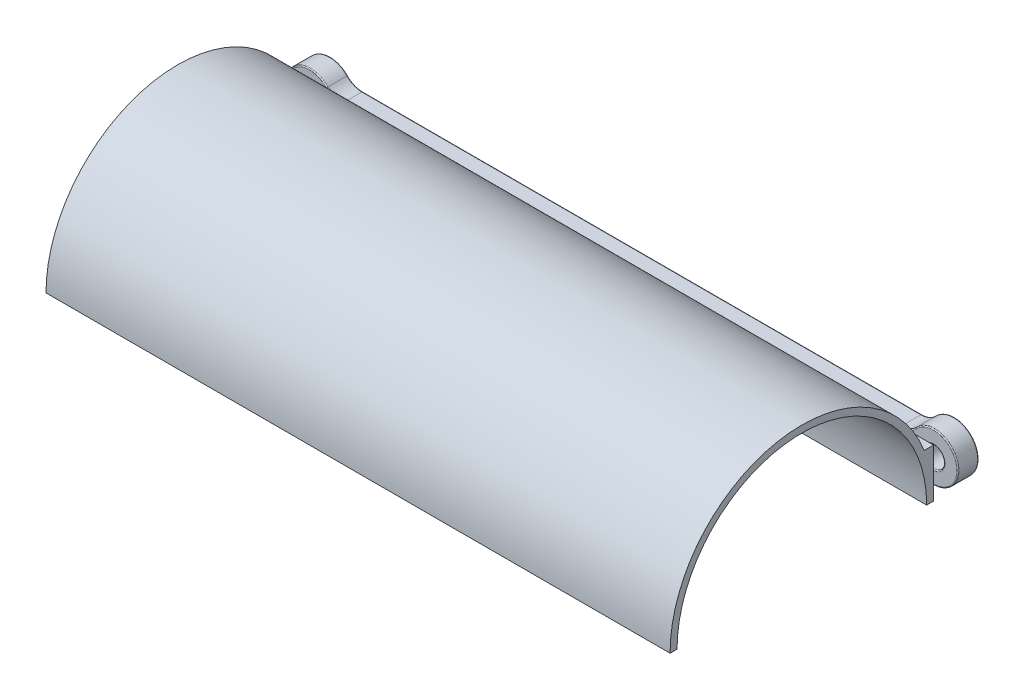
ISO-10303-21;
HEADER;
FILE_DESCRIPTION(('STEP AP214'),'2;1');
FILE_NAME('part.step','',(''),(''),'','','');
FILE_SCHEMA(('AUTOMOTIVE_DESIGN { 1 0 10303 214 1 1 1 1 }'));
ENDSEC;
DATA;
#1=APPLICATION_CONTEXT('core data for automotive mechanical design processes');
#2=APPLICATION_PROTOCOL_DEFINITION('international standard','automotive_design',2000,#1);
#3=PRODUCT_CONTEXT('',#1,'mechanical');
#4=PRODUCT('Part','Part','',(#3));
#5=PRODUCT_RELATED_PRODUCT_CATEGORY('part','',(#4));
#6=PRODUCT_DEFINITION_FORMATION('','',#4);
#7=PRODUCT_DEFINITION_CONTEXT('part definition',#1,'design');
#8=PRODUCT_DEFINITION('design','',#6,#7);
#9=PRODUCT_DEFINITION_SHAPE('','',#8);
#10=(LENGTH_UNIT() NAMED_UNIT(*) SI_UNIT(.MILLI.,.METRE.));
#11=(NAMED_UNIT(*) PLANE_ANGLE_UNIT() SI_UNIT($,.RADIAN.));
#12=(NAMED_UNIT(*) SI_UNIT($,.STERADIAN.) SOLID_ANGLE_UNIT());
#13=UNCERTAINTY_MEASURE_WITH_UNIT(LENGTH_MEASURE(1.E-05),#10,'distance_accuracy_value','');
#14=(GEOMETRIC_REPRESENTATION_CONTEXT(3) GLOBAL_UNCERTAINTY_ASSIGNED_CONTEXT((#13)) GLOBAL_UNIT_ASSIGNED_CONTEXT((#10,
#11,#12)) REPRESENTATION_CONTEXT('',''));
#15=CARTESIAN_POINT('',(0.,0.,0.));
#16=DIRECTION('',(0.,0.,1.));
#17=DIRECTION('',(1.,0.,0.));
#18=AXIS2_PLACEMENT_3D('',#15,#16,#17);
#19=CARTESIAN_POINT('',(0.,0.,1.5));
#20=DIRECTION('',(0.,0.,1.));
#21=DIRECTION('',(1.,0.,0.));
#22=AXIS2_PLACEMENT_3D('',#19,#20,#21);
#23=PLANE('',#22);
#24=DIRECTION('',(1.,0.,0.));
#25=VECTOR('',#24,1.);
#26=CARTESIAN_POINT('',(-42.485291572496,1.5,1.5));
#27=LINE('',#26,#25);
#28=CARTESIAN_POINT('',(86.2700528757915,1.5,1.5));
#29=VERTEX_POINT('',#28);
#30=CARTESIAN_POINT('',(89.3126136457566,1.5,1.5));
#31=VERTEX_POINT('',#30);
#32=EDGE_CURVE('E60',#29,#31,#27,.T.);
#33=ORIENTED_EDGE('',*,*,#32,.T.);
#34=CARTESIAN_POINT('',(90.,0.,1.5));
#35=DIRECTION('',(0.,0.,1.));
#36=DIRECTION('',(1.,0.,0.));
#37=AXIS2_PLACEMENT_3D('',#34,#35,#36);
#38=CIRCLE('',#37,1.65);
#39=CARTESIAN_POINT('',(90.,-1.65,1.5));
#40=VERTEX_POINT('',#39);
#41=EDGE_CURVE('E52',#31,#40,#38,.F.);
#42=ORIENTED_EDGE('',*,*,#41,.T.);
#43=DIRECTION('',(0.,1.,0.));
#44=VECTOR('',#43,1.);
#45=CARTESIAN_POINT('',(90.,1.5,1.5));
#46=LINE('',#45,#44);
#47=CARTESIAN_POINT('',(90.,-3.34999999999999,1.5));
#48=VERTEX_POINT('',#47);
#49=EDGE_CURVE('E224',#48,#40,#46,.T.);
#50=ORIENTED_EDGE('',*,*,#49,.F.);
#51=CARTESIAN_POINT('',(90.,0.,1.5));
#52=DIRECTION('',(0.,0.,1.));
#53=DIRECTION('',(1.,0.,0.));
#54=AXIS2_PLACEMENT_3D('',#51,#52,#53);
#55=CIRCLE('',#54,3.34999999999999);
#56=CARTESIAN_POINT('',(87.5826318776295,2.31923076923076,1.5));
#57=VERTEX_POINT('',#56);
#58=EDGE_CURVE('E387',#48,#57,#55,.T.);
#59=ORIENTED_EDGE('',*,*,#58,.T.);
#60=CARTESIAN_POINT('',(85.3095842401766,4.5,1.5));
#61=DIRECTION('',(0.,0.,1.));
#62=DIRECTION('',(1.,0.,0.));
#63=AXIS2_PLACEMENT_3D('',#60,#61,#62);
#64=CIRCLE('',#63,3.15);
#65=EDGE_CURVE('E392',#57,#29,#64,.F.);
#66=ORIENTED_EDGE('',*,*,#65,.T.);
#67=EDGE_LOOP('',(#33,#42,#50,#59,#66));
#68=FACE_BOUND('',#67,.T.);
#69=ADVANCED_FACE('F43',(#68),#23,.T.);
#70=CARTESIAN_POINT('',(0.,1.5,1.5));
#71=DIRECTION('',(0.,1.,0.));
#72=DIRECTION('',(0.,0.,1.));
#73=AXIS2_PLACEMENT_3D('',#70,#71,#72);
#74=PLANE('',#73);
#75=DIRECTION('',(0.,0.,1.));
#76=VECTOR('',#75,1.);
#77=CARTESIAN_POINT('',(85.3095842401766,1.5,-1.5));
#78=LINE('',#77,#76);
#79=CARTESIAN_POINT('',(85.3095842401766,1.5,1.35));
#80=VERTEX_POINT('',#79);
#81=CARTESIAN_POINT('',(85.3095842401766,1.5,-1.35));
#82=VERTEX_POINT('',#81);
#83=EDGE_CURVE('E296',#80,#82,#78,.F.);
#84=ORIENTED_EDGE('',*,*,#83,.T.);
#85=DIRECTION('',(1.,0.,0.));
#86=VECTOR('',#85,1.);
#87=CARTESIAN_POINT('',(4.69041575982343,1.5,-1.35));
#88=LINE('',#87,#86);
#89=CARTESIAN_POINT('',(4.69041575982343,1.5,-1.35));
#90=VERTEX_POINT('',#89);
#91=EDGE_CURVE('E358',#82,#90,#88,.F.);
#92=ORIENTED_EDGE('',*,*,#91,.T.);
#93=DIRECTION('',(0.,0.,-1.));
#94=VECTOR('',#93,1.);
#95=CARTESIAN_POINT('',(4.69041575982343,1.5,1.5));
#96=LINE('',#95,#94);
#97=CARTESIAN_POINT('',(4.69041575982343,1.5,1.35));
#98=VERTEX_POINT('',#97);
#99=EDGE_CURVE('E293',#90,#98,#96,.F.);
#100=ORIENTED_EDGE('',*,*,#99,.T.);
#101=DIRECTION('',(1.,0.,0.));
#102=VECTOR('',#101,1.);
#103=CARTESIAN_POINT('',(0.,1.5,1.35));
#104=LINE('',#103,#102);
#105=EDGE_CURVE('E356',#98,#80,#104,.T.);
#106=ORIENTED_EDGE('',*,*,#105,.T.);
#107=EDGE_LOOP('',(#84,#92,#100,#106));
#108=FACE_BOUND('',#107,.T.);
#109=ADVANCED_FACE('F508',(#108),#74,.T.);
#110=CARTESIAN_POINT('',(0.,0.,1.5));
#111=DIRECTION('',(0.,0.,-1.));
#112=DIRECTION('',(-1.,0.,0.));
#113=AXIS2_PLACEMENT_3D('',#110,#111,#112);
#114=CYLINDRICAL_SURFACE('',#113,3.5);
#115=DIRECTION('',(0.,0.,-1.));
#116=VECTOR('',#115,1.);
#117=CARTESIAN_POINT('',(2.52560848605877,2.42307692307692,1.5));
#118=LINE('',#117,#116);
#119=CARTESIAN_POINT('',(2.52560848605877,2.42307692307692,1.35));
#120=VERTEX_POINT('',#119);
#121=CARTESIAN_POINT('',(2.52560848605877,2.42307692307692,-1.35));
#122=VERTEX_POINT('',#121);
#123=EDGE_CURVE('E281',#120,#122,#118,.T.);
#124=ORIENTED_EDGE('',*,*,#123,.T.);
#125=CARTESIAN_POINT('',(0.,0.,-1.35));
#126=DIRECTION('',(0.,0.,1.));
#127=DIRECTION('',(1.,0.,0.));
#128=AXIS2_PLACEMENT_3D('',#125,#126,#127);
#129=CIRCLE('',#128,3.5);
#130=CARTESIAN_POINT('',(2.52560848605877,-2.42307692307692,-1.35));
#131=VERTEX_POINT('',#130);
#132=EDGE_CURVE('E366',#122,#131,#129,.T.);
#133=ORIENTED_EDGE('',*,*,#132,.T.);
#134=DIRECTION('',(0.,0.,-1.));
#135=VECTOR('',#134,1.);
#136=CARTESIAN_POINT('',(2.52560848605877,-2.42307692307692,1.5));
#137=LINE('',#136,#135);
#138=CARTESIAN_POINT('',(2.52560848605877,-2.42307692307692,1.35));
#139=VERTEX_POINT('',#138);
#140=EDGE_CURVE('E284',#131,#139,#137,.F.);
#141=ORIENTED_EDGE('',*,*,#140,.T.);
#142=CARTESIAN_POINT('',(0.,0.,1.35));
#143=DIRECTION('',(0.,0.,1.));
#144=DIRECTION('',(1.,0.,0.));
#145=AXIS2_PLACEMENT_3D('',#142,#143,#144);
#146=CIRCLE('',#145,3.5);
#147=EDGE_CURVE('E364',#139,#120,#146,.F.);
#148=ORIENTED_EDGE('',*,*,#147,.T.);
#149=EDGE_LOOP('',(#124,#133,#141,#148));
#150=FACE_BOUND('',#149,.T.);
#151=ADVANCED_FACE('F452',(#150),#114,.T.);
#152=CARTESIAN_POINT('',(0.,-1.5,1.5));
#153=DIRECTION('',(0.,1.,0.));
#154=DIRECTION('',(0.,0.,1.));
#155=AXIS2_PLACEMENT_3D('',#152,#153,#154);
#156=PLANE('',#155);
#157=DIRECTION('',(0.,0.,1.));
#158=VECTOR('',#157,1.);
#159=CARTESIAN_POINT('',(4.69041575982343,-1.5,-1.5));
#160=LINE('',#159,#158);
#161=CARTESIAN_POINT('',(4.69041575982343,-1.5,1.35));
#162=VERTEX_POINT('',#161);
#163=CARTESIAN_POINT('',(4.69041575982343,-1.5,-1.35));
#164=VERTEX_POINT('',#163);
#165=EDGE_CURVE('E277',#162,#164,#160,.F.);
#166=ORIENTED_EDGE('',*,*,#165,.T.);
#167=DIRECTION('',(1.,0.,0.));
#168=VECTOR('',#167,1.);
#169=CARTESIAN_POINT('',(0.,-1.5,-1.35));
#170=LINE('',#169,#168);
#171=CARTESIAN_POINT('',(85.3095842401766,-1.5,-1.35));
#172=VERTEX_POINT('',#171);
#173=EDGE_CURVE('E341',#164,#172,#170,.T.);
#174=ORIENTED_EDGE('',*,*,#173,.T.);
#175=DIRECTION('',(0.,0.,-1.));
#176=VECTOR('',#175,1.);
#177=CARTESIAN_POINT('',(85.3095842401766,-1.5,1.5));
#178=LINE('',#177,#176);
#179=CARTESIAN_POINT('',(85.3095842401766,-1.5,1.35));
#180=VERTEX_POINT('',#179);
#181=EDGE_CURVE('E274',#172,#180,#178,.F.);
#182=ORIENTED_EDGE('',*,*,#181,.T.);
#183=DIRECTION('',(1.,0.,0.));
#184=VECTOR('',#183,1.);
#185=CARTESIAN_POINT('',(4.69041575982343,-1.5,1.35));
#186=LINE('',#185,#184);
#187=EDGE_CURVE('E339',#180,#162,#186,.F.);
#188=ORIENTED_EDGE('',*,*,#187,.T.);
#189=EDGE_LOOP('',(#166,#174,#182,#188));
#190=FACE_BOUND('',#189,.T.);
#191=ADVANCED_FACE('F466',(#190),#156,.F.);
#192=CARTESIAN_POINT('',(0.,0.,1.5));
#193=DIRECTION('',(0.,0.,-1.));
#194=DIRECTION('',(-1.,0.,0.));
#195=AXIS2_PLACEMENT_3D('',#192,#193,#194);
#196=CYLINDRICAL_SURFACE('',#195,1.5);
#197=CARTESIAN_POINT('',(0.,0.,-1.35));
#198=DIRECTION('',(0.,0.,1.));
#199=DIRECTION('',(1.,0.,0.));
#200=AXIS2_PLACEMENT_3D('',#197,#198,#199);
#201=CIRCLE('',#200,1.5);
#202=CARTESIAN_POINT('',(1.5,0.,-1.35));
#203=VERTEX_POINT('',#202);
#204=EDGE_CURVE('E331',#203,#203,#201,.F.);
#205=ORIENTED_EDGE('',*,*,#204,.T.);
#206=EDGE_LOOP('',(#205));
#207=FACE_BOUND('',#206,.T.);
#208=CARTESIAN_POINT('',(0.,0.,1.35));
#209=DIRECTION('',(0.,0.,1.));
#210=DIRECTION('',(1.,0.,0.));
#211=AXIS2_PLACEMENT_3D('',#208,#209,#210);
#212=CIRCLE('',#211,1.5);
#213=CARTESIAN_POINT('',(1.5,0.,1.35));
#214=VERTEX_POINT('',#213);
#215=EDGE_CURVE('E328',#214,#214,#212,.T.);
#216=ORIENTED_EDGE('',*,*,#215,.T.);
#217=EDGE_LOOP('',(#216));
#218=FACE_BOUND('',#217,.T.);
#219=ADVANCED_FACE('F605',(#207,#218),#196,.F.);
#220=CARTESIAN_POINT('',(90.,0.,1.5));
#221=DIRECTION('',(0.,0.,-1.));
#222=DIRECTION('',(-1.,0.,0.));
#223=AXIS2_PLACEMENT_3D('',#220,#221,#222);
#224=CYLINDRICAL_SURFACE('',#223,3.49999999999999);
#225=DIRECTION('',(0.,0.,-1.));
#226=VECTOR('',#225,1.);
#227=CARTESIAN_POINT('',(87.4743915139412,-2.42307692307692,1.5));
#228=LINE('',#227,#226);
#229=CARTESIAN_POINT('',(87.4743915139412,-2.42307692307692,1.35));
#230=VERTEX_POINT('',#229);
#231=CARTESIAN_POINT('',(87.4743915139412,-2.42307692307692,-1.35));
#232=VERTEX_POINT('',#231);
#233=EDGE_CURVE('E290',#230,#232,#228,.T.);
#234=ORIENTED_EDGE('',*,*,#233,.T.);
#235=CARTESIAN_POINT('',(90.,0.,-1.35));
#236=DIRECTION('',(0.,0.,1.));
#237=DIRECTION('',(1.,0.,0.));
#238=AXIS2_PLACEMENT_3D('',#235,#236,#237);
#239=CIRCLE('',#238,3.49999999999999);
#240=CARTESIAN_POINT('',(87.4743915139412,2.42307692307692,-1.35));
#241=VERTEX_POINT('',#240);
#242=EDGE_CURVE('E349',#232,#241,#239,.T.);
#243=ORIENTED_EDGE('',*,*,#242,.T.);
#244=DIRECTION('',(0.,0.,-1.));
#245=VECTOR('',#244,1.);
#246=CARTESIAN_POINT('',(87.4743915139412,2.42307692307692,1.5));
#247=LINE('',#246,#245);
#248=CARTESIAN_POINT('',(87.4743915139412,2.42307692307692,1.35));
#249=VERTEX_POINT('',#248);
#250=EDGE_CURVE('E287',#241,#249,#247,.F.);
#251=ORIENTED_EDGE('',*,*,#250,.T.);
#252=CARTESIAN_POINT('',(90.,0.,1.35));
#253=DIRECTION('',(0.,0.,1.));
#254=DIRECTION('',(1.,0.,0.));
#255=AXIS2_PLACEMENT_3D('',#252,#253,#254);
#256=CIRCLE('',#255,3.49999999999999);
#257=EDGE_CURVE('E347',#249,#230,#256,.F.);
#258=ORIENTED_EDGE('',*,*,#257,.T.);
#259=EDGE_LOOP('',(#234,#243,#251,#258));
#260=FACE_BOUND('',#259,.T.);
#261=ADVANCED_FACE('F491',(#260),#224,.T.);
#262=CARTESIAN_POINT('',(90.,0.,1.5));
#263=DIRECTION('',(0.,0.,-1.));
#264=DIRECTION('',(-1.,0.,0.));
#265=AXIS2_PLACEMENT_3D('',#262,#263,#264);
#266=CYLINDRICAL_SURFACE('',#265,1.5);
#267=CARTESIAN_POINT('',(90.,0.,-1.35));
#268=DIRECTION('',(0.,0.,1.));
#269=DIRECTION('',(1.,0.,0.));
#270=AXIS2_PLACEMENT_3D('',#267,#268,#269);
#271=CIRCLE('',#270,1.5);
#272=CARTESIAN_POINT('',(91.5,0.,-1.35));
#273=VERTEX_POINT('',#272);
#274=EDGE_CURVE('E302',#273,#273,#271,.F.);
#275=ORIENTED_EDGE('',*,*,#274,.T.);
#276=EDGE_LOOP('',(#275));
#277=FACE_BOUND('',#276,.T.);
#278=CARTESIAN_POINT('',(90.,0.,1.35));
#279=DIRECTION('',(0.,0.,1.));
#280=DIRECTION('',(1.,0.,0.));
#281=AXIS2_PLACEMENT_3D('',#278,#279,#280);
#282=CIRCLE('',#281,1.5);
#283=CARTESIAN_POINT('',(91.5,0.,1.35));
#284=VERTEX_POINT('',#283);
#285=EDGE_CURVE('E299',#284,#284,#282,.T.);
#286=ORIENTED_EDGE('',*,*,#285,.T.);
#287=EDGE_LOOP('',(#286));
#288=FACE_BOUND('',#287,.T.);
#289=ADVANCED_FACE('F594',(#277,#288),#266,.F.);
#290=CARTESIAN_POINT('',(0.687386354239177,1.50000000000192,1.5));
#291=VERTEX_POINT('',#290);
#292=CARTESIAN_POINT('',(3.72994712420851,1.5,1.5));
#293=VERTEX_POINT('',#292);
#294=EDGE_CURVE('E264',#291,#293,#27,.T.);
#295=ORIENTED_EDGE('',*,*,#294,.T.);
#296=CARTESIAN_POINT('',(4.69041575982343,4.5,1.5));
#297=DIRECTION('',(0.,0.,1.));
#298=DIRECTION('',(1.,0.,0.));
#299=AXIS2_PLACEMENT_3D('',#296,#297,#298);
#300=CIRCLE('',#299,3.15);
#301=CARTESIAN_POINT('',(2.41736812237054,2.31923076923077,1.5));
#302=VERTEX_POINT('',#301);
#303=EDGE_CURVE('E371',#293,#302,#300,.F.);
#304=ORIENTED_EDGE('',*,*,#303,.T.);
#305=CARTESIAN_POINT('',(0.,0.,1.5));
#306=DIRECTION('',(0.,0.,1.));
#307=DIRECTION('',(1.,0.,0.));
#308=AXIS2_PLACEMENT_3D('',#305,#306,#307);
#309=CIRCLE('',#308,3.35);
#310=CARTESIAN_POINT('',(0.,-3.35,1.5));
#311=VERTEX_POINT('',#310);
#312=EDGE_CURVE('E375',#302,#311,#309,.T.);
#313=ORIENTED_EDGE('',*,*,#312,.T.);
#314=DIRECTION('',(0.,-1.,0.));
#315=VECTOR('',#314,1.);
#316=CARTESIAN_POINT('',(0.,1.5,1.5));
#317=LINE('',#316,#315);
#318=CARTESIAN_POINT('',(0.,-1.65,1.5));
#319=VERTEX_POINT('',#318);
#320=EDGE_CURVE('E544',#319,#311,#317,.T.);
#321=ORIENTED_EDGE('',*,*,#320,.F.);
#322=CARTESIAN_POINT('',(0.,0.,1.5));
#323=DIRECTION('',(0.,0.,1.));
#324=DIRECTION('',(1.,0.,0.));
#325=AXIS2_PLACEMENT_3D('',#322,#323,#324);
#326=CIRCLE('',#325,1.65);
#327=EDGE_CURVE('E394',#319,#291,#326,.F.);
#328=ORIENTED_EDGE('',*,*,#327,.T.);
#329=EDGE_LOOP('',(#295,#304,#313,#321,#328));
#330=FACE_BOUND('',#329,.T.);
#331=ADVANCED_FACE('F543',(#330),#23,.T.);
#332=CARTESIAN_POINT('',(0.,0.,-1.5));
#333=DIRECTION('',(0.,0.,1.));
#334=DIRECTION('',(1.,0.,0.));
#335=AXIS2_PLACEMENT_3D('',#332,#333,#334);
#336=PLANE('',#335);
#337=CARTESIAN_POINT('',(90.,0.,-1.5));
#338=DIRECTION('',(0.,0.,1.));
#339=DIRECTION('',(1.,0.,0.));
#340=AXIS2_PLACEMENT_3D('',#337,#338,#339);
#341=CIRCLE('',#340,1.65);
#342=CARTESIAN_POINT('',(91.65,0.,-1.5));
#343=VERTEX_POINT('',#342);
#344=EDGE_CURVE('E325',#343,#343,#341,.T.);
#345=ORIENTED_EDGE('',*,*,#344,.T.);
#346=EDGE_LOOP('',(#345));
#347=FACE_BOUND('',#346,.T.);
#348=CARTESIAN_POINT('',(0.,0.,-1.5));
#349=DIRECTION('',(0.,0.,1.));
#350=DIRECTION('',(1.,0.,0.));
#351=AXIS2_PLACEMENT_3D('',#348,#349,#350);
#352=CIRCLE('',#351,1.65);
#353=CARTESIAN_POINT('',(1.65,0.,-1.5));
#354=VERTEX_POINT('',#353);
#355=EDGE_CURVE('E322',#354,#354,#352,.T.);
#356=ORIENTED_EDGE('',*,*,#355,.T.);
#357=EDGE_LOOP('',(#356));
#358=FACE_BOUND('',#357,.T.);
#359=DIRECTION('',(1.,0.,0.));
#360=VECTOR('',#359,1.);
#361=CARTESIAN_POINT('',(0.,-1.35,-1.5));
#362=LINE('',#361,#360);
#363=CARTESIAN_POINT('',(85.3095842401766,-1.35,-1.5));
#364=VERTEX_POINT('',#363);
#365=CARTESIAN_POINT('',(4.69041575982343,-1.35,-1.5));
#366=VERTEX_POINT('',#365);
#367=EDGE_CURVE('E317',#364,#366,#362,.F.);
#368=ORIENTED_EDGE('',*,*,#367,.T.);
#369=CARTESIAN_POINT('',(4.69041575982343,-4.5,-1.5));
#370=DIRECTION('',(0.,0.,1.));
#371=DIRECTION('',(1.,0.,0.));
#372=AXIS2_PLACEMENT_3D('',#369,#370,#371);
#373=CIRCLE('',#372,3.15);
#374=CARTESIAN_POINT('',(2.41736812237054,-2.31923076923077,-1.5));
#375=VERTEX_POINT('',#374);
#376=EDGE_CURVE('E319',#366,#375,#373,.T.);
#377=ORIENTED_EDGE('',*,*,#376,.T.);
#378=CARTESIAN_POINT('',(0.,0.,-1.5));
#379=DIRECTION('',(0.,0.,1.));
#380=DIRECTION('',(1.,0.,0.));
#381=AXIS2_PLACEMENT_3D('',#378,#379,#380);
#382=CIRCLE('',#381,3.35);
#383=CARTESIAN_POINT('',(2.41736812237054,2.31923076923077,-1.5));
#384=VERTEX_POINT('',#383);
#385=EDGE_CURVE('E305',#375,#384,#382,.F.);
#386=ORIENTED_EDGE('',*,*,#385,.T.);
#387=CARTESIAN_POINT('',(4.69041575982343,4.5,-1.5));
#388=DIRECTION('',(0.,0.,1.));
#389=DIRECTION('',(1.,0.,0.));
#390=AXIS2_PLACEMENT_3D('',#387,#388,#389);
#391=CIRCLE('',#390,3.15);
#392=CARTESIAN_POINT('',(4.69041575982343,1.35,-1.5));
#393=VERTEX_POINT('',#392);
#394=EDGE_CURVE('E307',#384,#393,#391,.T.);
#395=ORIENTED_EDGE('',*,*,#394,.T.);
#396=DIRECTION('',(1.,0.,0.));
#397=VECTOR('',#396,1.);
#398=CARTESIAN_POINT('',(85.3095842401766,1.35,-1.5));
#399=LINE('',#398,#397);
#400=CARTESIAN_POINT('',(85.3095842401766,1.35,-1.5));
#401=VERTEX_POINT('',#400);
#402=EDGE_CURVE('E309',#393,#401,#399,.T.);
#403=ORIENTED_EDGE('',*,*,#402,.T.);
#404=CARTESIAN_POINT('',(85.3095842401766,4.5,-1.5));
#405=DIRECTION('',(0.,0.,1.));
#406=DIRECTION('',(1.,0.,0.));
#407=AXIS2_PLACEMENT_3D('',#404,#405,#406);
#408=CIRCLE('',#407,3.15);
#409=CARTESIAN_POINT('',(87.5826318776295,2.31923076923076,-1.5));
#410=VERTEX_POINT('',#409);
#411=EDGE_CURVE('E311',#401,#410,#408,.T.);
#412=ORIENTED_EDGE('',*,*,#411,.T.);
#413=CARTESIAN_POINT('',(90.,0.,-1.5));
#414=DIRECTION('',(0.,0.,1.));
#415=DIRECTION('',(1.,0.,0.));
#416=AXIS2_PLACEMENT_3D('',#413,#414,#415);
#417=CIRCLE('',#416,3.34999999999999);
#418=CARTESIAN_POINT('',(87.5826318776295,-2.31923076923076,-1.5));
#419=VERTEX_POINT('',#418);
#420=EDGE_CURVE('E313',#410,#419,#417,.F.);
#421=ORIENTED_EDGE('',*,*,#420,.T.);
#422=CARTESIAN_POINT('',(85.3095842401766,-4.5,-1.5));
#423=DIRECTION('',(0.,0.,1.));
#424=DIRECTION('',(1.,0.,0.));
#425=AXIS2_PLACEMENT_3D('',#422,#423,#424);
#426=CIRCLE('',#425,3.15);
#427=EDGE_CURVE('E315',#419,#364,#426,.T.);
#428=ORIENTED_EDGE('',*,*,#427,.T.);
#429=EDGE_LOOP('',(#368,#377,#386,#395,#403,#412,#421,#428));
#430=FACE_BOUND('',#429,.T.);
#431=ADVANCED_FACE('F482',(#347,#358,#430),#336,.F.);
#432=CARTESIAN_POINT('',(4.69041575982343,-4.5,1.5));
#433=DIRECTION('',(0.,0.,-1.));
#434=DIRECTION('',(-1.,0.,0.));
#435=AXIS2_PLACEMENT_3D('',#432,#433,#434);
#436=CYLINDRICAL_SURFACE('',#435,3.);
#437=ORIENTED_EDGE('',*,*,#140,.F.);
#438=CARTESIAN_POINT('',(4.69041575982343,-4.5,-1.35));
#439=DIRECTION('',(0.,0.,1.));
#440=DIRECTION('',(1.,0.,0.));
#441=AXIS2_PLACEMENT_3D('',#438,#439,#440);
#442=CIRCLE('',#441,3.);
#443=EDGE_CURVE('E336',#131,#164,#442,.F.);
#444=ORIENTED_EDGE('',*,*,#443,.T.);
#445=ORIENTED_EDGE('',*,*,#165,.F.);
#446=CARTESIAN_POINT('',(4.69041575982343,-4.5,1.35));
#447=DIRECTION('',(0.,0.,1.));
#448=DIRECTION('',(1.,0.,0.));
#449=AXIS2_PLACEMENT_3D('',#446,#447,#448);
#450=CIRCLE('',#449,3.);
#451=EDGE_CURVE('E334',#162,#139,#450,.T.);
#452=ORIENTED_EDGE('',*,*,#451,.T.);
#453=EDGE_LOOP('',(#437,#444,#445,#452));
#454=FACE_BOUND('',#453,.T.);
#455=ADVANCED_FACE('F449',(#454),#436,.F.);
#456=CARTESIAN_POINT('',(85.3095842401766,-4.5,1.5));
#457=DIRECTION('',(0.,0.,-1.));
#458=DIRECTION('',(-1.,0.,0.));
#459=AXIS2_PLACEMENT_3D('',#456,#457,#458);
#460=CYLINDRICAL_SURFACE('',#459,3.);
#461=ORIENTED_EDGE('',*,*,#181,.F.);
#462=CARTESIAN_POINT('',(85.3095842401766,-4.5,-1.35));
#463=DIRECTION('',(0.,0.,1.));
#464=DIRECTION('',(1.,0.,0.));
#465=AXIS2_PLACEMENT_3D('',#462,#463,#464);
#466=CIRCLE('',#465,3.);
#467=EDGE_CURVE('E345',#172,#232,#466,.F.);
#468=ORIENTED_EDGE('',*,*,#467,.T.);
#469=ORIENTED_EDGE('',*,*,#233,.F.);
#470=CARTESIAN_POINT('',(85.3095842401766,-4.5,1.35));
#471=DIRECTION('',(0.,0.,1.));
#472=DIRECTION('',(1.,0.,0.));
#473=AXIS2_PLACEMENT_3D('',#470,#471,#472);
#474=CIRCLE('',#473,3.);
#475=EDGE_CURVE('E343',#230,#180,#474,.T.);
#476=ORIENTED_EDGE('',*,*,#475,.T.);
#477=EDGE_LOOP('',(#461,#468,#469,#476));
#478=FACE_BOUND('',#477,.T.);
#479=ADVANCED_FACE('F470',(#478),#460,.F.);
#480=CARTESIAN_POINT('',(85.3095842401766,4.5,1.5));
#481=DIRECTION('',(0.,0.,-1.));
#482=DIRECTION('',(-1.,0.,0.));
#483=AXIS2_PLACEMENT_3D('',#480,#481,#482);
#484=CYLINDRICAL_SURFACE('',#483,3.);
#485=ORIENTED_EDGE('',*,*,#250,.F.);
#486=CARTESIAN_POINT('',(85.3095842401766,4.5,-1.35));
#487=DIRECTION('',(0.,0.,1.));
#488=DIRECTION('',(1.,0.,0.));
#489=AXIS2_PLACEMENT_3D('',#486,#487,#488);
#490=CIRCLE('',#489,3.);
#491=EDGE_CURVE('E354',#241,#82,#490,.F.);
#492=ORIENTED_EDGE('',*,*,#491,.T.);
#493=ORIENTED_EDGE('',*,*,#83,.F.);
#494=CARTESIAN_POINT('',(85.3095842401766,4.5,1.35));
#495=DIRECTION('',(0.,0.,1.));
#496=DIRECTION('',(1.,0.,0.));
#497=AXIS2_PLACEMENT_3D('',#494,#495,#496);
#498=CIRCLE('',#497,3.);
#499=EDGE_CURVE('E351',#80,#249,#498,.T.);
#500=ORIENTED_EDGE('',*,*,#499,.T.);
#501=EDGE_LOOP('',(#485,#492,#493,#500));
#502=FACE_BOUND('',#501,.T.);
#503=ADVANCED_FACE('F494',(#502),#484,.F.);
#504=CARTESIAN_POINT('',(4.69041575982343,4.5,1.5));
#505=DIRECTION('',(0.,0.,-1.));
#506=DIRECTION('',(-1.,0.,0.));
#507=AXIS2_PLACEMENT_3D('',#504,#505,#506);
#508=CYLINDRICAL_SURFACE('',#507,3.);
#509=ORIENTED_EDGE('',*,*,#99,.F.);
#510=CARTESIAN_POINT('',(4.69041575982343,4.5,-1.35));
#511=DIRECTION('',(0.,0.,1.));
#512=DIRECTION('',(1.,0.,0.));
#513=AXIS2_PLACEMENT_3D('',#510,#511,#512);
#514=CIRCLE('',#513,3.);
#515=EDGE_CURVE('E362',#90,#122,#514,.F.);
#516=ORIENTED_EDGE('',*,*,#515,.T.);
#517=ORIENTED_EDGE('',*,*,#123,.F.);
#518=CARTESIAN_POINT('',(4.69041575982343,4.5,1.35));
#519=DIRECTION('',(0.,0.,1.));
#520=DIRECTION('',(1.,0.,0.));
#521=AXIS2_PLACEMENT_3D('',#518,#519,#520);
#522=CIRCLE('',#521,3.);
#523=EDGE_CURVE('E360',#120,#98,#522,.T.);
#524=ORIENTED_EDGE('',*,*,#523,.T.);
#525=EDGE_LOOP('',(#509,#516,#517,#524));
#526=FACE_BOUND('',#525,.T.);
#527=ADVANCED_FACE('F511',(#526),#508,.F.);
#528=CARTESIAN_POINT('',(90.,0.,-1.35));
#529=DIRECTION('',(0.,0.,1.));
#530=DIRECTION('',(1.,0.,0.));
#531=AXIS2_PLACEMENT_3D('',#528,#529,#530);
#532=TOROIDAL_SURFACE('',#531,1.65,0.15);
#533=ORIENTED_EDGE('',*,*,#344,.F.);
#534=EDGE_LOOP('',(#533));
#535=FACE_BOUND('',#534,.T.);
#536=ORIENTED_EDGE('',*,*,#274,.F.);
#537=EDGE_LOOP('',(#536));
#538=FACE_BOUND('',#537,.T.);
#539=ADVANCED_FACE('F624',(#535,#538),#532,.T.);
#540=CARTESIAN_POINT('',(0.,0.,-1.35));
#541=DIRECTION('',(0.,0.,1.));
#542=DIRECTION('',(1.,0.,0.));
#543=AXIS2_PLACEMENT_3D('',#540,#541,#542);
#544=TOROIDAL_SURFACE('',#543,1.65,0.15);
#545=ORIENTED_EDGE('',*,*,#204,.F.);
#546=EDGE_LOOP('',(#545));
#547=FACE_BOUND('',#546,.T.);
#548=ORIENTED_EDGE('',*,*,#355,.F.);
#549=EDGE_LOOP('',(#548));
#550=FACE_BOUND('',#549,.T.);
#551=ADVANCED_FACE('F627',(#547,#550),#544,.T.);
#552=CARTESIAN_POINT('',(85.3095842401766,4.5,-1.35));
#553=DIRECTION('',(0.,0.,1.));
#554=DIRECTION('',(1.,0.,0.));
#555=AXIS2_PLACEMENT_3D('',#552,#553,#554);
#556=TOROIDAL_SURFACE('',#555,3.15,0.15);
#557=CARTESIAN_POINT('',(85.3095842401766,1.35,-1.35));
#558=DIRECTION('',(-1.,0.,0.));
#559=DIRECTION('',(0.,0.,1.));
#560=AXIS2_PLACEMENT_3D('',#557,#558,#559);
#561=CIRCLE('',#560,0.15);
#562=EDGE_CURVE('E413',#82,#401,#561,.T.);
#563=ORIENTED_EDGE('',*,*,#562,.F.);
#564=ORIENTED_EDGE('',*,*,#491,.F.);
#565=CARTESIAN_POINT('',(87.5826318776295,2.31923076923076,-1.35));
#566=DIRECTION('',(0.692307692307722,0.721602424588192,0.));
#567=DIRECTION('',(-0.721602424588192,0.692307692307722,0.));
#568=AXIS2_PLACEMENT_3D('',#565,#566,#567);
#569=CIRCLE('',#568,0.15);
#570=EDGE_CURVE('E278',#410,#241,#569,.T.);
#571=ORIENTED_EDGE('',*,*,#570,.F.);
#572=ORIENTED_EDGE('',*,*,#411,.F.);
#573=EDGE_LOOP('',(#563,#564,#571,#572));
#574=FACE_BOUND('',#573,.T.);
#575=ADVANCED_FACE('F499',(#574),#556,.T.);
#576=CARTESIAN_POINT('',(90.,0.,-1.35));
#577=DIRECTION('',(0.,0.,1.));
#578=DIRECTION('',(1.,0.,0.));
#579=AXIS2_PLACEMENT_3D('',#576,#577,#578);
#580=TOROIDAL_SURFACE('',#579,3.34999999999999,0.15);
#581=ORIENTED_EDGE('',*,*,#570,.T.);
#582=ORIENTED_EDGE('',*,*,#242,.F.);
#583=CARTESIAN_POINT('',(87.5826318776295,-2.31923076923076,-1.35));
#584=DIRECTION('',(-0.692307692307719,0.721602424588194,0.));
#585=DIRECTION('',(-0.721602424588194,-0.692307692307719,0.));
#586=AXIS2_PLACEMENT_3D('',#583,#584,#585);
#587=CIRCLE('',#586,0.15);
#588=EDGE_CURVE('E410',#419,#232,#587,.T.);
#589=ORIENTED_EDGE('',*,*,#588,.F.);
#590=ORIENTED_EDGE('',*,*,#420,.F.);
#591=EDGE_LOOP('',(#581,#582,#589,#590));
#592=FACE_BOUND('',#591,.T.);
#593=ADVANCED_FACE('F488',(#592),#580,.T.);
#594=CARTESIAN_POINT('',(0.,1.35,-1.35));
#595=DIRECTION('',(-1.,0.,0.));
#596=DIRECTION('',(0.,0.,1.));
#597=AXIS2_PLACEMENT_3D('',#594,#595,#596);
#598=CYLINDRICAL_SURFACE('',#597,0.15);
#599=ORIENTED_EDGE('',*,*,#562,.T.);
#600=ORIENTED_EDGE('',*,*,#402,.F.);
#601=CARTESIAN_POINT('',(4.69041575982343,1.35,-1.35));
#602=DIRECTION('',(-1.,0.,0.));
#603=DIRECTION('',(0.,0.,1.));
#604=AXIS2_PLACEMENT_3D('',#601,#602,#603);
#605=CIRCLE('',#604,0.15);
#606=EDGE_CURVE('E407',#90,#393,#605,.T.);
#607=ORIENTED_EDGE('',*,*,#606,.F.);
#608=ORIENTED_EDGE('',*,*,#91,.F.);
#609=EDGE_LOOP('',(#599,#600,#607,#608));
#610=FACE_BOUND('',#609,.T.);
#611=ADVANCED_FACE('F504',(#610),#598,.T.);
#612=CARTESIAN_POINT('',(85.3095842401766,-4.5,-1.35));
#613=DIRECTION('',(0.,0.,1.));
#614=DIRECTION('',(1.,0.,0.));
#615=AXIS2_PLACEMENT_3D('',#612,#613,#614);
#616=TOROIDAL_SURFACE('',#615,3.15,0.15);
#617=ORIENTED_EDGE('',*,*,#588,.T.);
#618=ORIENTED_EDGE('',*,*,#467,.F.);
#619=CARTESIAN_POINT('',(85.3095842401766,-1.35,-1.35));
#620=DIRECTION('',(-1.,0.,0.));
#621=DIRECTION('',(0.,0.,1.));
#622=AXIS2_PLACEMENT_3D('',#619,#620,#621);
#623=CIRCLE('',#622,0.15);
#624=EDGE_CURVE('E404',#364,#172,#623,.T.);
#625=ORIENTED_EDGE('',*,*,#624,.F.);
#626=ORIENTED_EDGE('',*,*,#427,.F.);
#627=EDGE_LOOP('',(#617,#618,#625,#626));
#628=FACE_BOUND('',#627,.T.);
#629=ADVANCED_FACE('F475',(#628),#616,.T.);
#630=CARTESIAN_POINT('',(4.69041575982343,4.5,-1.35));
#631=DIRECTION('',(0.,0.,1.));
#632=DIRECTION('',(1.,0.,0.));
#633=AXIS2_PLACEMENT_3D('',#630,#631,#632);
#634=TOROIDAL_SURFACE('',#633,3.15,0.15);
#635=ORIENTED_EDGE('',*,*,#606,.T.);
#636=ORIENTED_EDGE('',*,*,#394,.F.);
#637=CARTESIAN_POINT('',(2.41736812237054,2.31923076923077,-1.35));
#638=DIRECTION('',(-0.692307692307693,0.72160242458822,0.));
#639=DIRECTION('',(-0.72160242458822,-0.692307692307693,0.));
#640=AXIS2_PLACEMENT_3D('',#637,#638,#639);
#641=CIRCLE('',#640,0.15);
#642=EDGE_CURVE('E401',#122,#384,#641,.T.);
#643=ORIENTED_EDGE('',*,*,#642,.F.);
#644=ORIENTED_EDGE('',*,*,#515,.F.);
#645=EDGE_LOOP('',(#635,#636,#643,#644));
#646=FACE_BOUND('',#645,.T.);
#647=ADVANCED_FACE('F639',(#646),#634,.T.);
#648=CARTESIAN_POINT('',(0.,-1.35,-1.35));
#649=DIRECTION('',(1.,0.,0.));
#650=DIRECTION('',(0.,0.,-1.));
#651=AXIS2_PLACEMENT_3D('',#648,#649,#650);
#652=CYLINDRICAL_SURFACE('',#651,0.15);
#653=ORIENTED_EDGE('',*,*,#624,.T.);
#654=ORIENTED_EDGE('',*,*,#173,.F.);
#655=CARTESIAN_POINT('',(4.69041575982343,-1.35,-1.35));
#656=DIRECTION('',(-1.,0.,0.));
#657=DIRECTION('',(0.,0.,1.));
#658=AXIS2_PLACEMENT_3D('',#655,#656,#657);
#659=CIRCLE('',#658,0.15);
#660=EDGE_CURVE('E399',#366,#164,#659,.T.);
#661=ORIENTED_EDGE('',*,*,#660,.F.);
#662=ORIENTED_EDGE('',*,*,#367,.F.);
#663=EDGE_LOOP('',(#653,#654,#661,#662));
#664=FACE_BOUND('',#663,.T.);
#665=ADVANCED_FACE('F480',(#664),#652,.T.);
#666=CARTESIAN_POINT('',(0.,0.,-1.35));
#667=DIRECTION('',(0.,0.,1.));
#668=DIRECTION('',(1.,0.,0.));
#669=AXIS2_PLACEMENT_3D('',#666,#667,#668);
#670=TOROIDAL_SURFACE('',#669,3.35,0.15);
#671=ORIENTED_EDGE('',*,*,#642,.T.);
#672=ORIENTED_EDGE('',*,*,#385,.F.);
#673=CARTESIAN_POINT('',(2.41736812237054,-2.31923076923077,-1.35));
#674=DIRECTION('',(0.692307692307693,0.72160242458822,0.));
#675=DIRECTION('',(-0.72160242458822,0.692307692307693,0.));
#676=AXIS2_PLACEMENT_3D('',#673,#674,#675);
#677=CIRCLE('',#676,0.15);
#678=EDGE_CURVE('E397',#131,#375,#677,.T.);
#679=ORIENTED_EDGE('',*,*,#678,.F.);
#680=ORIENTED_EDGE('',*,*,#132,.F.);
#681=EDGE_LOOP('',(#671,#672,#679,#680));
#682=FACE_BOUND('',#681,.T.);
#683=ADVANCED_FACE('F458',(#682),#670,.T.);
#684=CARTESIAN_POINT('',(4.69041575982343,-4.5,-1.35));
#685=DIRECTION('',(0.,0.,1.));
#686=DIRECTION('',(1.,0.,0.));
#687=AXIS2_PLACEMENT_3D('',#684,#685,#686);
#688=TOROIDAL_SURFACE('',#687,3.15,0.15);
#689=ORIENTED_EDGE('',*,*,#660,.T.);
#690=ORIENTED_EDGE('',*,*,#443,.F.);
#691=ORIENTED_EDGE('',*,*,#678,.T.);
#692=ORIENTED_EDGE('',*,*,#376,.F.);
#693=EDGE_LOOP('',(#689,#690,#691,#692));
#694=FACE_BOUND('',#693,.T.);
#695=ADVANCED_FACE('F462',(#694),#688,.T.);
#696=CARTESIAN_POINT('',(90.,0.,1.35));
#697=DIRECTION('',(0.,0.,1.));
#698=DIRECTION('',(1.,0.,0.));
#699=AXIS2_PLACEMENT_3D('',#696,#697,#698);
#700=TOROIDAL_SURFACE('',#699,1.65,0.15);
#701=ORIENTED_EDGE('',*,*,#285,.F.);
#702=EDGE_LOOP('',(#701));
#703=FACE_BOUND('',#702,.T.);
#704=EDGE_CURVE('E11',#40,#31,#38,.F.);
#705=ORIENTED_EDGE('',*,*,#704,.F.);
#706=ORIENTED_EDGE('',*,*,#41,.F.);
#707=EDGE_LOOP('',(#705,#706));
#708=FACE_BOUND('',#707,.T.);
#709=ADVANCED_FACE('F634',(#703,#708),#700,.T.);
#710=CARTESIAN_POINT('',(0.,0.,1.35));
#711=DIRECTION('',(0.,0.,1.));
#712=DIRECTION('',(1.,0.,0.));
#713=AXIS2_PLACEMENT_3D('',#710,#711,#712);
#714=TOROIDAL_SURFACE('',#713,1.65,0.15);
#715=ORIENTED_EDGE('',*,*,#327,.F.);
#716=CARTESIAN_POINT('',(0.,0.,1.5));
#717=DIRECTION('',(0.,0.,1.));
#718=DIRECTION('',(1.,0.,0.));
#719=AXIS2_PLACEMENT_3D('',#716,#717,#718);
#720=CIRCLE('',#719,1.65);
#721=EDGE_CURVE('E270',#291,#319,#720,.F.);
#722=ORIENTED_EDGE('',*,*,#721,.F.);
#723=EDGE_LOOP('',(#715,#722));
#724=FACE_BOUND('',#723,.T.);
#725=ORIENTED_EDGE('',*,*,#215,.F.);
#726=EDGE_LOOP('',(#725));
#727=FACE_BOUND('',#726,.T.);
#728=ADVANCED_FACE('F653',(#724,#727),#714,.T.);
#729=CARTESIAN_POINT('',(4.69041575982343,-4.5,1.35));
#730=DIRECTION('',(0.,0.,1.));
#731=DIRECTION('',(1.,0.,0.));
#732=AXIS2_PLACEMENT_3D('',#729,#730,#731);
#733=TOROIDAL_SURFACE('',#732,3.15,0.15);
#734=CARTESIAN_POINT('',(2.41736812237054,-2.31923076923077,1.35));
#735=DIRECTION('',(-0.692307692307693,-0.72160242458822,0.));
#736=DIRECTION('',(0.72160242458822,-0.692307692307693,0.));
#737=AXIS2_PLACEMENT_3D('',#734,#735,#736);
#738=CIRCLE('',#737,0.15);
#739=CARTESIAN_POINT('',(2.41736812237054,-2.31923076923077,1.5));
#740=VERTEX_POINT('',#739);
#741=EDGE_CURVE('E433',#139,#740,#738,.T.);
#742=ORIENTED_EDGE('',*,*,#741,.F.);
#743=ORIENTED_EDGE('',*,*,#451,.F.);
#744=CARTESIAN_POINT('',(4.69041575982343,-1.35,1.35));
#745=DIRECTION('',(1.,0.,0.));
#746=DIRECTION('',(0.,0.,-1.));
#747=AXIS2_PLACEMENT_3D('',#744,#745,#746);
#748=CIRCLE('',#747,0.15);
#749=CARTESIAN_POINT('',(4.69041575982343,-1.35,1.5));
#750=VERTEX_POINT('',#749);
#751=EDGE_CURVE('E47',#750,#162,#748,.T.);
#752=ORIENTED_EDGE('',*,*,#751,.F.);
#753=CARTESIAN_POINT('',(4.69041575982343,-4.5,1.5));
#754=DIRECTION('',(0.,0.,1.));
#755=DIRECTION('',(1.,0.,0.));
#756=AXIS2_PLACEMENT_3D('',#753,#754,#755);
#757=CIRCLE('',#756,3.15);
#758=EDGE_CURVE('E378',#740,#750,#757,.F.);
#759=ORIENTED_EDGE('',*,*,#758,.F.);
#760=EDGE_LOOP('',(#742,#743,#752,#759));
#761=FACE_BOUND('',#760,.T.);
#762=ADVANCED_FACE('F45',(#761),#733,.T.);
#763=CARTESIAN_POINT('',(0.,-1.35,1.35));
#764=DIRECTION('',(-1.,0.,0.));
#765=DIRECTION('',(0.,0.,1.));
#766=AXIS2_PLACEMENT_3D('',#763,#764,#765);
#767=CYLINDRICAL_SURFACE('',#766,0.15);
#768=ORIENTED_EDGE('',*,*,#751,.T.);
#769=ORIENTED_EDGE('',*,*,#187,.F.);
#770=CARTESIAN_POINT('',(85.3095842401766,-1.35,1.35));
#771=DIRECTION('',(1.,0.,0.));
#772=DIRECTION('',(0.,0.,-1.));
#773=AXIS2_PLACEMENT_3D('',#770,#771,#772);
#774=CIRCLE('',#773,0.15);
#775=CARTESIAN_POINT('',(85.3095842401766,-1.35,1.5));
#776=VERTEX_POINT('',#775);
#777=EDGE_CURVE('E431',#776,#180,#774,.T.);
#778=ORIENTED_EDGE('',*,*,#777,.F.);
#779=DIRECTION('',(1.,0.,0.));
#780=VECTOR('',#779,1.);
#781=CARTESIAN_POINT('',(85.3095842401766,-1.35,1.5));
#782=LINE('',#781,#780);
#783=EDGE_CURVE('E381',#750,#776,#782,.T.);
#784=ORIENTED_EDGE('',*,*,#783,.F.);
#785=EDGE_LOOP('',(#768,#769,#778,#784));
#786=FACE_BOUND('',#785,.T.);
#787=ADVANCED_FACE('F443',(#786),#767,.T.);
#788=CARTESIAN_POINT('',(0.,0.,1.35));
#789=DIRECTION('',(0.,0.,1.));
#790=DIRECTION('',(1.,0.,0.));
#791=AXIS2_PLACEMENT_3D('',#788,#789,#790);
#792=TOROIDAL_SURFACE('',#791,3.35,0.15);
#793=ORIENTED_EDGE('',*,*,#741,.T.);
#794=CARTESIAN_POINT('',(0.,0.,1.5));
#795=DIRECTION('',(0.,0.,1.));
#796=DIRECTION('',(1.,0.,0.));
#797=AXIS2_PLACEMENT_3D('',#794,#795,#796);
#798=CIRCLE('',#797,3.35);
#799=EDGE_CURVE('E267',#740,#311,#798,.F.);
#800=ORIENTED_EDGE('',*,*,#799,.T.);
#801=ORIENTED_EDGE('',*,*,#312,.F.);
#802=CARTESIAN_POINT('',(2.41736812237054,2.31923076923077,1.35));
#803=DIRECTION('',(0.692307692307693,-0.72160242458822,0.));
#804=DIRECTION('',(0.72160242458822,0.692307692307693,0.));
#805=AXIS2_PLACEMENT_3D('',#802,#803,#804);
#806=CIRCLE('',#805,0.15);
#807=EDGE_CURVE('E428',#120,#302,#806,.T.);
#808=ORIENTED_EDGE('',*,*,#807,.F.);
#809=ORIENTED_EDGE('',*,*,#147,.F.);
#810=EDGE_LOOP('',(#793,#800,#801,#808,#809));
#811=FACE_BOUND('',#810,.T.);
#812=ADVANCED_FACE('F541',(#811),#792,.T.);
#813=CARTESIAN_POINT('',(85.3095842401766,-4.5,1.35));
#814=DIRECTION('',(0.,0.,1.));
#815=DIRECTION('',(1.,0.,0.));
#816=AXIS2_PLACEMENT_3D('',#813,#814,#815);
#817=TOROIDAL_SURFACE('',#816,3.15,0.15);
#818=ORIENTED_EDGE('',*,*,#777,.T.);
#819=ORIENTED_EDGE('',*,*,#475,.F.);
#820=CARTESIAN_POINT('',(87.5826318776295,-2.31923076923076,1.35));
#821=DIRECTION('',(0.692307692307722,-0.721602424588192,0.));
#822=DIRECTION('',(0.721602424588192,0.692307692307722,0.));
#823=AXIS2_PLACEMENT_3D('',#820,#821,#822);
#824=CIRCLE('',#823,0.15);
#825=CARTESIAN_POINT('',(87.5826318776295,-2.31923076923076,1.5));
#826=VERTEX_POINT('',#825);
#827=EDGE_CURVE('E425',#826,#230,#824,.T.);
#828=ORIENTED_EDGE('',*,*,#827,.F.);
#829=CARTESIAN_POINT('',(85.3095842401766,-4.5,1.5));
#830=DIRECTION('',(0.,0.,1.));
#831=DIRECTION('',(1.,0.,0.));
#832=AXIS2_PLACEMENT_3D('',#829,#830,#831);
#833=CIRCLE('',#832,3.15);
#834=EDGE_CURVE('E384',#776,#826,#833,.F.);
#835=ORIENTED_EDGE('',*,*,#834,.F.);
#836=EDGE_LOOP('',(#818,#819,#828,#835));
#837=FACE_BOUND('',#836,.T.);
#838=ADVANCED_FACE('F532',(#837),#817,.T.);
#839=CARTESIAN_POINT('',(4.69041575982343,4.5,1.35));
#840=DIRECTION('',(0.,0.,1.));
#841=DIRECTION('',(1.,0.,0.));
#842=AXIS2_PLACEMENT_3D('',#839,#840,#841);
#843=TOROIDAL_SURFACE('',#842,3.15,0.15);
#844=ORIENTED_EDGE('',*,*,#807,.T.);
#845=ORIENTED_EDGE('',*,*,#303,.F.);
#846=CARTESIAN_POINT('',(4.69041575982343,1.35,1.5));
#847=VERTEX_POINT('',#846);
#848=EDGE_CURVE('E372',#847,#293,#300,.F.);
#849=ORIENTED_EDGE('',*,*,#848,.F.);
#850=CARTESIAN_POINT('',(4.69041575982343,1.35,1.35));
#851=DIRECTION('',(1.,0.,0.));
#852=DIRECTION('',(0.,0.,-1.));
#853=AXIS2_PLACEMENT_3D('',#850,#851,#852);
#854=CIRCLE('',#853,0.15);
#855=EDGE_CURVE('E422',#98,#847,#854,.T.);
#856=ORIENTED_EDGE('',*,*,#855,.F.);
#857=ORIENTED_EDGE('',*,*,#523,.F.);
#858=EDGE_LOOP('',(#844,#845,#849,#856,#857));
#859=FACE_BOUND('',#858,.T.);
#860=ADVANCED_FACE('F515',(#859),#843,.T.);
#861=CARTESIAN_POINT('',(90.,0.,1.35));
#862=DIRECTION('',(0.,0.,1.));
#863=DIRECTION('',(1.,0.,0.));
#864=AXIS2_PLACEMENT_3D('',#861,#862,#863);
#865=TOROIDAL_SURFACE('',#864,3.34999999999999,0.15);
#866=ORIENTED_EDGE('',*,*,#827,.T.);
#867=ORIENTED_EDGE('',*,*,#257,.F.);
#868=CARTESIAN_POINT('',(87.5826318776295,2.31923076923076,1.35));
#869=DIRECTION('',(-0.692307692307719,-0.721602424588194,0.));
#870=DIRECTION('',(0.721602424588194,-0.692307692307719,0.));
#871=AXIS2_PLACEMENT_3D('',#868,#869,#870);
#872=CIRCLE('',#871,0.15);
#873=EDGE_CURVE('E420',#57,#249,#872,.T.);
#874=ORIENTED_EDGE('',*,*,#873,.F.);
#875=ORIENTED_EDGE('',*,*,#58,.F.);
#876=EDGE_CURVE('E388',#826,#48,#55,.T.);
#877=ORIENTED_EDGE('',*,*,#876,.F.);
#878=EDGE_LOOP('',(#866,#867,#874,#875,#877));
#879=FACE_BOUND('',#878,.T.);
#880=ADVANCED_FACE('F529',(#879),#865,.T.);
#881=CARTESIAN_POINT('',(0.,1.35,1.35));
#882=DIRECTION('',(1.,0.,0.));
#883=DIRECTION('',(0.,0.,-1.));
#884=AXIS2_PLACEMENT_3D('',#881,#882,#883);
#885=CYLINDRICAL_SURFACE('',#884,0.15);
#886=ORIENTED_EDGE('',*,*,#855,.T.);
#887=DIRECTION('',(1.,0.,0.));
#888=VECTOR('',#887,1.);
#889=CARTESIAN_POINT('',(0.,1.35,1.5));
#890=LINE('',#889,#888);
#891=CARTESIAN_POINT('',(85.3095842401766,1.35,1.5));
#892=VERTEX_POINT('',#891);
#893=EDGE_CURVE('E368',#892,#847,#890,.F.);
#894=ORIENTED_EDGE('',*,*,#893,.F.);
#895=CARTESIAN_POINT('',(85.3095842401766,1.35,1.35));
#896=DIRECTION('',(1.,0.,0.));
#897=DIRECTION('',(0.,0.,-1.));
#898=AXIS2_PLACEMENT_3D('',#895,#896,#897);
#899=CIRCLE('',#898,0.15);
#900=EDGE_CURVE('E273',#80,#892,#899,.T.);
#901=ORIENTED_EDGE('',*,*,#900,.F.);
#902=ORIENTED_EDGE('',*,*,#105,.F.);
#903=EDGE_LOOP('',(#886,#894,#901,#902));
#904=FACE_BOUND('',#903,.T.);
#905=ADVANCED_FACE('F520',(#904),#885,.T.);
#906=CARTESIAN_POINT('',(85.3095842401766,4.5,1.35));
#907=DIRECTION('',(0.,0.,1.));
#908=DIRECTION('',(1.,0.,0.));
#909=AXIS2_PLACEMENT_3D('',#906,#907,#908);
#910=TOROIDAL_SURFACE('',#909,3.15,0.15);
#911=ORIENTED_EDGE('',*,*,#873,.T.);
#912=ORIENTED_EDGE('',*,*,#499,.F.);
#913=ORIENTED_EDGE('',*,*,#900,.T.);
#914=EDGE_CURVE('E391',#29,#892,#64,.F.);
#915=ORIENTED_EDGE('',*,*,#914,.F.);
#916=ORIENTED_EDGE('',*,*,#65,.F.);
#917=EDGE_LOOP('',(#911,#912,#913,#915,#916));
#918=FACE_BOUND('',#917,.T.);
#919=ADVANCED_FACE('F522',(#918),#910,.T.);
#920=CARTESIAN_POINT('',(-42.485291572496,1.5,1.5));
#921=DIRECTION('',(0.,0.,-1.));
#922=DIRECTION('',(-1.,0.,0.));
#923=AXIS2_PLACEMENT_3D('',#920,#921,#922);
#924=PLANE('',#923);
#925=CARTESIAN_POINT('',(90.,1.5,1.5));
#926=VERTEX_POINT('',#925);
#927=EDGE_CURVE('E217',#40,#926,#46,.T.);
#928=ORIENTED_EDGE('',*,*,#927,.F.);
#929=ORIENTED_EDGE('',*,*,#704,.T.);
#930=EDGE_CURVE('E229',#31,#926,#27,.T.);
#931=ORIENTED_EDGE('',*,*,#930,.T.);
#932=EDGE_LOOP('',(#928,#929,#931));
#933=FACE_BOUND('',#932,.T.);
#934=ADVANCED_FACE('F230',(#933),#924,.T.);
#935=CARTESIAN_POINT('',(0.,1.5,1.5));
#936=VERTEX_POINT('',#935);
#937=EDGE_CURVE('E234',#936,#291,#27,.T.);
#938=ORIENTED_EDGE('',*,*,#937,.T.);
#939=ORIENTED_EDGE('',*,*,#721,.T.);
#940=EDGE_CURVE('E268',#936,#319,#317,.T.);
#941=ORIENTED_EDGE('',*,*,#940,.F.);
#942=EDGE_LOOP('',(#938,#939,#941));
#943=FACE_BOUND('',#942,.T.);
#944=ADVANCED_FACE('F555',(#943),#924,.T.);
#945=ORIENTED_EDGE('',*,*,#893,.T.);
#946=ORIENTED_EDGE('',*,*,#848,.T.);
#947=EDGE_CURVE('E551',#293,#29,#27,.T.);
#948=ORIENTED_EDGE('',*,*,#947,.T.);
#949=ORIENTED_EDGE('',*,*,#914,.T.);
#950=EDGE_LOOP('',(#945,#946,#948,#949));
#951=FACE_BOUND('',#950,.T.);
#952=ADVANCED_FACE('F550',(#951),#924,.T.);
#953=ORIENTED_EDGE('',*,*,#799,.F.);
#954=ORIENTED_EDGE('',*,*,#758,.T.);
#955=ORIENTED_EDGE('',*,*,#783,.T.);
#956=ORIENTED_EDGE('',*,*,#834,.T.);
#957=ORIENTED_EDGE('',*,*,#876,.T.);
#958=CARTESIAN_POINT('',(90.,-5.5,1.5));
#959=VERTEX_POINT('',#958);
#960=EDGE_CURVE('E227',#959,#48,#46,.T.);
#961=ORIENTED_EDGE('',*,*,#960,.F.);
#962=DIRECTION('',(1.,0.,0.));
#963=VECTOR('',#962,1.);
#964=CARTESIAN_POINT('',(-42.485291572496,-5.5,1.5));
#965=LINE('',#964,#963);
#966=CARTESIAN_POINT('',(0.,-5.5,1.5));
#967=VERTEX_POINT('',#966);
#968=EDGE_CURVE('E253',#967,#959,#965,.T.);
#969=ORIENTED_EDGE('',*,*,#968,.F.);
#970=EDGE_CURVE('E538',#311,#967,#317,.T.);
#971=ORIENTED_EDGE('',*,*,#970,.F.);
#972=EDGE_LOOP('',(#953,#954,#955,#956,#957,#961,#969,#971));
#973=FACE_BOUND('',#972,.T.);
#974=ADVANCED_FACE('F535',(#973),#924,.T.);
#975=CARTESIAN_POINT('',(-42.485291572496,-5.5,1.5));
#976=DIRECTION('',(0.,-1.,0.));
#977=DIRECTION('',(0.,0.,-1.));
#978=AXIS2_PLACEMENT_3D('',#975,#976,#977);
#979=PLANE('',#978);
#980=DIRECTION('',(0.,0.,1.));
#981=VECTOR('',#980,1.);
#982=CARTESIAN_POINT('',(0.,-5.5,1.5));
#983=LINE('',#982,#981);
#984=CARTESIAN_POINT('',(0.,-5.5,2.5));
#985=VERTEX_POINT('',#984);
#986=EDGE_CURVE('E559',#967,#985,#983,.T.);
#987=ORIENTED_EDGE('',*,*,#986,.F.);
#988=ORIENTED_EDGE('',*,*,#968,.T.);
#989=DIRECTION('',(0.,0.,-1.));
#990=VECTOR('',#989,1.);
#991=CARTESIAN_POINT('',(90.,-5.5,1.5));
#992=LINE('',#991,#990);
#993=CARTESIAN_POINT('',(90.,-5.5,2.5));
#994=VERTEX_POINT('',#993);
#995=EDGE_CURVE('E232',#994,#959,#992,.T.);
#996=ORIENTED_EDGE('',*,*,#995,.F.);
#997=DIRECTION('',(1.,0.,0.));
#998=VECTOR('',#997,1.);
#999=CARTESIAN_POINT('',(-42.485291572496,-5.5,2.5));
#1000=LINE('',#999,#998);
#1001=EDGE_CURVE('E256',#985,#994,#1000,.T.);
#1002=ORIENTED_EDGE('',*,*,#1001,.F.);
#1003=EDGE_LOOP('',(#987,#988,#996,#1002));
#1004=FACE_BOUND('',#1003,.T.);
#1005=ADVANCED_FACE('F583',(#1004),#979,.T.);
#1006=CARTESIAN_POINT('',(-42.485291572496,-5.5,20.5));
#1007=DIRECTION('',(1.,0.,0.));
#1008=DIRECTION('',(0.,0.,-1.));
#1009=AXIS2_PLACEMENT_3D('',#1006,#1007,#1008);
#1010=CYLINDRICAL_SURFACE('',#1009,18.);
#1011=CARTESIAN_POINT('',(0.,-5.5,20.5));
#1012=DIRECTION('',(1.,0.,0.));
#1013=DIRECTION('',(0.,0.,-1.));
#1014=AXIS2_PLACEMENT_3D('',#1011,#1012,#1013);
#1015=CIRCLE('',#1014,18.);
#1016=CARTESIAN_POINT('',(0.,-5.5,38.5));
#1017=VERTEX_POINT('',#1016);
#1018=EDGE_CURVE('E561',#985,#1017,#1015,.T.);
#1019=ORIENTED_EDGE('',*,*,#1018,.F.);
#1020=ORIENTED_EDGE('',*,*,#1001,.T.);
#1021=CARTESIAN_POINT('',(90.,-5.5,20.5));
#1022=DIRECTION('',(-1.,0.,0.));
#1023=DIRECTION('',(0.,0.,-1.));
#1024=AXIS2_PLACEMENT_3D('',#1021,#1022,#1023);
#1025=CIRCLE('',#1024,18.);
#1026=CARTESIAN_POINT('',(90.,-5.5,38.5));
#1027=VERTEX_POINT('',#1026);
#1028=EDGE_CURVE('E248',#1027,#994,#1025,.T.);
#1029=ORIENTED_EDGE('',*,*,#1028,.F.);
#1030=DIRECTION('',(1.,0.,0.));
#1031=VECTOR('',#1030,1.);
#1032=CARTESIAN_POINT('',(-42.485291572496,-5.5,38.5));
#1033=LINE('',#1032,#1031);
#1034=EDGE_CURVE('E258',#1017,#1027,#1033,.T.);
#1035=ORIENTED_EDGE('',*,*,#1034,.F.);
#1036=EDGE_LOOP('',(#1019,#1020,#1029,#1035));
#1037=FACE_BOUND('',#1036,.T.);
#1038=ADVANCED_FACE('F580',(#1037),#1010,.F.);
#1039=CARTESIAN_POINT('',(-42.485291572496,-5.5,39.5));
#1040=DIRECTION('',(0.,-1.,0.));
#1041=DIRECTION('',(0.,0.,-1.));
#1042=AXIS2_PLACEMENT_3D('',#1039,#1040,#1041);
#1043=PLANE('',#1042);
#1044=DIRECTION('',(0.,0.,1.));
#1045=VECTOR('',#1044,1.);
#1046=CARTESIAN_POINT('',(0.,-5.5,39.5));
#1047=LINE('',#1046,#1045);
#1048=CARTESIAN_POINT('',(0.,-5.5,39.5));
#1049=VERTEX_POINT('',#1048);
#1050=EDGE_CURVE('E563',#1017,#1049,#1047,.T.);
#1051=ORIENTED_EDGE('',*,*,#1050,.F.);
#1052=ORIENTED_EDGE('',*,*,#1034,.T.);
#1053=DIRECTION('',(0.,0.,-1.));
#1054=VECTOR('',#1053,1.);
#1055=CARTESIAN_POINT('',(90.,-5.5,39.5));
#1056=LINE('',#1055,#1054);
#1057=CARTESIAN_POINT('',(90.,-5.5,39.5));
#1058=VERTEX_POINT('',#1057);
#1059=EDGE_CURVE('E242',#1058,#1027,#1056,.T.);
#1060=ORIENTED_EDGE('',*,*,#1059,.F.);
#1061=DIRECTION('',(1.,0.,0.));
#1062=VECTOR('',#1061,1.);
#1063=CARTESIAN_POINT('',(-42.485291572496,-5.5,39.5));
#1064=LINE('',#1063,#1062);
#1065=EDGE_CURVE('E260',#1049,#1058,#1064,.T.);
#1066=ORIENTED_EDGE('',*,*,#1065,.F.);
#1067=EDGE_LOOP('',(#1051,#1052,#1060,#1066));
#1068=FACE_BOUND('',#1067,.T.);
#1069=ADVANCED_FACE('F577',(#1068),#1043,.T.);
#1070=CARTESIAN_POINT('',(-42.485291572496,-5.5,20.5));
#1071=DIRECTION('',(1.,0.,0.));
#1072=DIRECTION('',(0.,0.,-1.));
#1073=AXIS2_PLACEMENT_3D('',#1070,#1071,#1072);
#1074=CYLINDRICAL_SURFACE('',#1073,19.);
#1075=CARTESIAN_POINT('',(0.,-5.5,20.5));
#1076=DIRECTION('',(1.,0.,0.));
#1077=DIRECTION('',(0.,0.,-1.));
#1078=AXIS2_PLACEMENT_3D('',#1075,#1076,#1077);
#1079=CIRCLE('',#1078,19.);
#1080=CARTESIAN_POINT('',(0.,1.5,2.83647826734431));
#1081=VERTEX_POINT('',#1080);
#1082=EDGE_CURVE('E255',#1049,#1081,#1079,.F.);
#1083=ORIENTED_EDGE('',*,*,#1082,.F.);
#1084=ORIENTED_EDGE('',*,*,#1065,.T.);
#1085=CARTESIAN_POINT('',(90.,-5.5,20.5));
#1086=DIRECTION('',(1.,0.,0.));
#1087=DIRECTION('',(0.,0.,-1.));
#1088=AXIS2_PLACEMENT_3D('',#1085,#1086,#1087);
#1089=CIRCLE('',#1088,19.);
#1090=CARTESIAN_POINT('',(90.,1.5,2.83647826734431));
#1091=VERTEX_POINT('',#1090);
#1092=EDGE_CURVE('E240',#1091,#1058,#1089,.T.);
#1093=ORIENTED_EDGE('',*,*,#1092,.F.);
#1094=DIRECTION('',(1.,0.,0.));
#1095=VECTOR('',#1094,1.);
#1096=CARTESIAN_POINT('',(-42.485291572496,1.5,2.83647826734431));
#1097=LINE('',#1096,#1095);
#1098=EDGE_CURVE('E238',#1081,#1091,#1097,.T.);
#1099=ORIENTED_EDGE('',*,*,#1098,.F.);
#1100=EDGE_LOOP('',(#1083,#1084,#1093,#1099));
#1101=FACE_BOUND('',#1100,.T.);
#1102=ADVANCED_FACE('F572',(#1101),#1074,.T.);
#1103=CARTESIAN_POINT('',(-42.485291572496,1.5,2.83647826734431));
#1104=DIRECTION('',(0.,1.,0.));
#1105=DIRECTION('',(0.,0.,1.));
#1106=AXIS2_PLACEMENT_3D('',#1103,#1104,#1105);
#1107=PLANE('',#1106);
#1108=DIRECTION('',(0.,0.,-1.));
#1109=VECTOR('',#1108,1.);
#1110=CARTESIAN_POINT('',(0.,1.5,2.83647826734431));
#1111=LINE('',#1110,#1109);
#1112=EDGE_CURVE('E265',#1081,#936,#1111,.T.);
#1113=ORIENTED_EDGE('',*,*,#1112,.F.);
#1114=ORIENTED_EDGE('',*,*,#1098,.T.);
#1115=DIRECTION('',(0.,0.,1.));
#1116=VECTOR('',#1115,1.);
#1117=CARTESIAN_POINT('',(90.,1.5,2.83647826734431));
#1118=LINE('',#1117,#1116);
#1119=EDGE_CURVE('E223',#926,#1091,#1118,.T.);
#1120=ORIENTED_EDGE('',*,*,#1119,.F.);
#1121=ORIENTED_EDGE('',*,*,#930,.F.);
#1122=ORIENTED_EDGE('',*,*,#32,.F.);
#1123=ORIENTED_EDGE('',*,*,#947,.F.);
#1124=ORIENTED_EDGE('',*,*,#294,.F.);
#1125=ORIENTED_EDGE('',*,*,#937,.F.);
#1126=EDGE_LOOP('',(#1113,#1114,#1120,#1121,#1122,#1123,#1124,#1125));
#1127=FACE_BOUND('',#1126,.T.);
#1128=ADVANCED_FACE('F236',(#1127),#1107,.T.);
#1129=CARTESIAN_POINT('',(90.,-5.5,20.5));
#1130=DIRECTION('',(1.,0.,0.));
#1131=DIRECTION('',(0.,0.,-1.));
#1132=AXIS2_PLACEMENT_3D('',#1129,#1130,#1131);
#1133=PLANE('',#1132);
#1134=ORIENTED_EDGE('',*,*,#960,.T.);
#1135=ORIENTED_EDGE('',*,*,#49,.T.);
#1136=ORIENTED_EDGE('',*,*,#927,.T.);
#1137=ORIENTED_EDGE('',*,*,#1119,.T.);
#1138=ORIENTED_EDGE('',*,*,#1092,.T.);
#1139=ORIENTED_EDGE('',*,*,#1059,.T.);
#1140=ORIENTED_EDGE('',*,*,#1028,.T.);
#1141=ORIENTED_EDGE('',*,*,#995,.T.);
#1142=EDGE_LOOP('',(#1134,#1135,#1136,#1137,#1138,#1139,#1140,#1141));
#1143=FACE_BOUND('',#1142,.T.);
#1144=ADVANCED_FACE('F220',(#1143),#1133,.T.);
#1145=CARTESIAN_POINT('',(0.,0.,0.));
#1146=DIRECTION('',(1.,0.,0.));
#1147=DIRECTION('',(0.,0.,-1.));
#1148=AXIS2_PLACEMENT_3D('',#1145,#1146,#1147);
#1149=PLANE('',#1148);
#1150=ORIENTED_EDGE('',*,*,#940,.T.);
#1151=ORIENTED_EDGE('',*,*,#320,.T.);
#1152=ORIENTED_EDGE('',*,*,#970,.T.);
#1153=ORIENTED_EDGE('',*,*,#986,.T.);
#1154=ORIENTED_EDGE('',*,*,#1018,.T.);
#1155=ORIENTED_EDGE('',*,*,#1050,.T.);
#1156=ORIENTED_EDGE('',*,*,#1082,.T.);
#1157=ORIENTED_EDGE('',*,*,#1112,.T.);
#1158=EDGE_LOOP('',(#1150,#1151,#1152,#1153,#1154,#1155,#1156,#1157));
#1159=FACE_BOUND('',#1158,.T.);
#1160=ADVANCED_FACE('F568',(#1159),#1149,.F.);
#1161=CLOSED_SHELL('',(#69,#109,#151,#191,#219,#261,#289,#331,#431,#455,#479,#503,#527,#539,
#551,#575,#593,#611,#629,#647,#665,#683,#695,#709,#728,#762,#787,#812,#838,#860,#880,#905,#919,
#934,#944,#952,#974,#1005,#1038,#1069,#1102,#1128,#1144,#1160));
#1162=MANIFOLD_SOLID_BREP('B2',#1161);
#1163=ADVANCED_BREP_SHAPE_REPRESENTATION('',(#18,#1162),#14);
#1164=SHAPE_DEFINITION_REPRESENTATION(#9,#1163);
ENDSEC;
END-ISO-10303-21;
